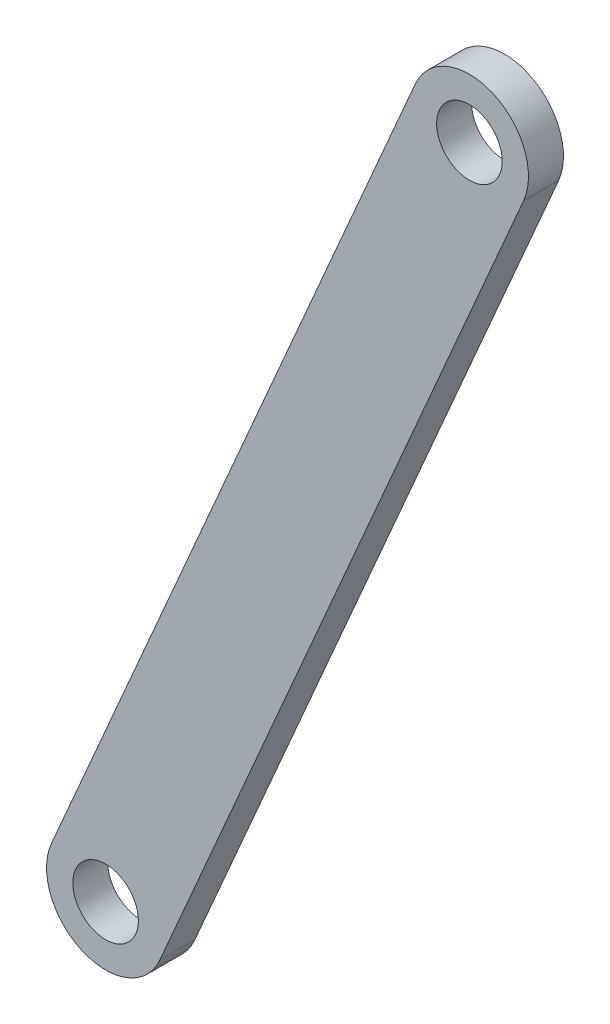
ISO-10303-21;
HEADER;
FILE_DESCRIPTION(('STEP AP214'),'2;1');
FILE_NAME('part.step','',(''),(''),'','','');
FILE_SCHEMA(('AUTOMOTIVE_DESIGN { 1 0 10303 214 1 1 1 1 }'));
ENDSEC;
DATA;
#1=APPLICATION_CONTEXT('core data for automotive mechanical design processes');
#2=APPLICATION_PROTOCOL_DEFINITION('international standard','automotive_design',2000,#1);
#3=PRODUCT_CONTEXT('',#1,'mechanical');
#4=PRODUCT('Part','Part','',(#3));
#5=PRODUCT_RELATED_PRODUCT_CATEGORY('part','',(#4));
#6=PRODUCT_DEFINITION_FORMATION('','',#4);
#7=PRODUCT_DEFINITION_CONTEXT('part definition',#1,'design');
#8=PRODUCT_DEFINITION('design','',#6,#7);
#9=PRODUCT_DEFINITION_SHAPE('','',#8);
#10=(LENGTH_UNIT() NAMED_UNIT(*) SI_UNIT(.MILLI.,.METRE.));
#11=(NAMED_UNIT(*) PLANE_ANGLE_UNIT() SI_UNIT($,.RADIAN.));
#12=(NAMED_UNIT(*) SI_UNIT($,.STERADIAN.) SOLID_ANGLE_UNIT());
#13=UNCERTAINTY_MEASURE_WITH_UNIT(LENGTH_MEASURE(1.E-05),#10,'distance_accuracy_value','');
#14=(GEOMETRIC_REPRESENTATION_CONTEXT(3) GLOBAL_UNCERTAINTY_ASSIGNED_CONTEXT((#13)) GLOBAL_UNIT_ASSIGNED_CONTEXT((#10,
#11,#12)) REPRESENTATION_CONTEXT('',''));
#15=CARTESIAN_POINT('',(0.,0.,0.));
#16=DIRECTION('',(0.,0.,1.));
#17=DIRECTION('',(1.,0.,0.));
#18=AXIS2_PLACEMENT_3D('',#15,#16,#17);
#19=CARTESIAN_POINT('',(0.,0.,50.));
#20=DIRECTION('',(0.,0.,1.));
#21=DIRECTION('',(1.,0.,0.));
#22=AXIS2_PLACEMENT_3D('',#19,#20,#21);
#23=PLANE('',#22);
#24=CARTESIAN_POINT('',(520.,1200.,50.));
#25=DIRECTION('',(0.,0.,1.));
#26=DIRECTION('',(1.,0.,0.));
#27=AXIS2_PLACEMENT_3D('',#24,#25,#26);
#28=CIRCLE('',#27,46.8749999999998);
#29=CARTESIAN_POINT('',(566.875,1200.,50.));
#30=VERTEX_POINT('',#29);
#31=EDGE_CURVE('E102',#30,#30,#28,.T.);
#32=ORIENTED_EDGE('',*,*,#31,.F.);
#33=EDGE_LOOP('',(#32));
#34=FACE_BOUND('',#33,.T.);
#35=CARTESIAN_POINT('',(0.,0.,50.));
#36=DIRECTION('',(0.,0.,1.));
#37=DIRECTION('',(1.,0.,0.));
#38=AXIS2_PLACEMENT_3D('',#35,#36,#37);
#39=CIRCLE('',#38,84.3750000000001);
#40=CARTESIAN_POINT('',(-77.4187558855249,33.5481275503941,50.));
#41=VERTEX_POINT('',#40);
#42=CARTESIAN_POINT('',(77.4187558855249,-33.5481275503941,50.));
#43=VERTEX_POINT('',#42);
#44=EDGE_CURVE('E87',#41,#43,#39,.T.);
#45=ORIENTED_EDGE('',*,*,#44,.T.);
#46=DIRECTION('',(0.3976074376343,0.917555625309924,0.));
#47=VECTOR('',#46,1.);
#48=CARTESIAN_POINT('',(77.4187558855249,-33.5481275503941,50.));
#49=LINE('',#48,#47);
#50=CARTESIAN_POINT('',(597.418755885525,1166.45187244961,50.));
#51=VERTEX_POINT('',#50);
#52=EDGE_CURVE('E82',#43,#51,#49,.T.);
#53=ORIENTED_EDGE('',*,*,#52,.T.);
#54=CARTESIAN_POINT('',(520.,1200.,50.));
#55=DIRECTION('',(0.,0.,1.));
#56=DIRECTION('',(1.,0.,0.));
#57=AXIS2_PLACEMENT_3D('',#54,#55,#56);
#58=CIRCLE('',#57,84.3749999999999);
#59=CARTESIAN_POINT('',(442.581244114475,1233.54812755039,50.));
#60=VERTEX_POINT('',#59);
#61=EDGE_CURVE('E85',#51,#60,#58,.T.);
#62=ORIENTED_EDGE('',*,*,#61,.T.);
#63=DIRECTION('',(-0.3976074376343,-0.917555625309924,0.));
#64=VECTOR('',#63,1.);
#65=CARTESIAN_POINT('',(-77.4187558855249,33.5481275503941,50.));
#66=LINE('',#65,#64);
#67=EDGE_CURVE('E52',#60,#41,#66,.T.);
#68=ORIENTED_EDGE('',*,*,#67,.T.);
#69=EDGE_LOOP('',(#45,#53,#62,#68));
#70=FACE_BOUND('',#69,.T.);
#71=CARTESIAN_POINT('',(0.,0.,50.));
#72=DIRECTION('',(0.,0.,1.));
#73=DIRECTION('',(1.,0.,0.));
#74=AXIS2_PLACEMENT_3D('',#71,#72,#73);
#75=CIRCLE('',#74,46.875);
#76=CARTESIAN_POINT('',(46.875,0.,50.));
#77=VERTEX_POINT('',#76);
#78=EDGE_CURVE('E117',#77,#77,#75,.T.);
#79=ORIENTED_EDGE('',*,*,#78,.F.);
#80=EDGE_LOOP('',(#79));
#81=FACE_BOUND('',#80,.T.);
#82=ADVANCED_FACE('F35',(#34,#70,#81),#23,.T.);
#83=CARTESIAN_POINT('',(0.,0.,0.));
#84=DIRECTION('',(0.,0.,1.));
#85=DIRECTION('',(1.,0.,0.));
#86=AXIS2_PLACEMENT_3D('',#83,#84,#85);
#87=PLANE('',#86);
#88=CARTESIAN_POINT('',(520.,1200.,0.));
#89=DIRECTION('',(0.,0.,1.));
#90=DIRECTION('',(1.,0.,0.));
#91=AXIS2_PLACEMENT_3D('',#88,#89,#90);
#92=CIRCLE('',#91,46.8749999999998);
#93=CARTESIAN_POINT('',(566.875,1200.,0.));
#94=VERTEX_POINT('',#93);
#95=EDGE_CURVE('E114',#94,#94,#92,.T.);
#96=ORIENTED_EDGE('',*,*,#95,.T.);
#97=EDGE_LOOP('',(#96));
#98=FACE_BOUND('',#97,.T.);
#99=CARTESIAN_POINT('',(0.,0.,0.));
#100=DIRECTION('',(0.,0.,1.));
#101=DIRECTION('',(1.,0.,0.));
#102=AXIS2_PLACEMENT_3D('',#99,#100,#101);
#103=CIRCLE('',#102,84.3750000000001);
#104=CARTESIAN_POINT('',(-77.4187558855249,33.5481275503941,0.));
#105=VERTEX_POINT('',#104);
#106=CARTESIAN_POINT('',(77.4187558855249,-33.5481275503941,0.));
#107=VERTEX_POINT('',#106);
#108=EDGE_CURVE('E99',#105,#107,#103,.T.);
#109=ORIENTED_EDGE('',*,*,#108,.F.);
#110=DIRECTION('',(-0.3976074376343,-0.917555625309924,0.));
#111=VECTOR('',#110,1.);
#112=CARTESIAN_POINT('',(-77.4187558855249,33.5481275503941,0.));
#113=LINE('',#112,#111);
#114=CARTESIAN_POINT('',(442.581244114475,1233.54812755039,0.));
#115=VERTEX_POINT('',#114);
#116=EDGE_CURVE('E75',#115,#105,#113,.T.);
#117=ORIENTED_EDGE('',*,*,#116,.F.);
#118=CARTESIAN_POINT('',(520.,1200.,0.));
#119=DIRECTION('',(0.,0.,1.));
#120=DIRECTION('',(1.,0.,0.));
#121=AXIS2_PLACEMENT_3D('',#118,#119,#120);
#122=CIRCLE('',#121,84.3749999999999);
#123=CARTESIAN_POINT('',(597.418755885525,1166.45187244961,0.));
#124=VERTEX_POINT('',#123);
#125=EDGE_CURVE('E69',#124,#115,#122,.T.);
#126=ORIENTED_EDGE('',*,*,#125,.F.);
#127=DIRECTION('',(0.3976074376343,0.917555625309924,0.));
#128=VECTOR('',#127,1.);
#129=CARTESIAN_POINT('',(77.4187558855249,-33.5481275503941,0.));
#130=LINE('',#129,#128);
#131=EDGE_CURVE('E91',#107,#124,#130,.T.);
#132=ORIENTED_EDGE('',*,*,#131,.F.);
#133=EDGE_LOOP('',(#109,#117,#126,#132));
#134=FACE_BOUND('',#133,.T.);
#135=CARTESIAN_POINT('',(0.,0.,0.));
#136=DIRECTION('',(0.,0.,1.));
#137=DIRECTION('',(1.,0.,0.));
#138=AXIS2_PLACEMENT_3D('',#135,#136,#137);
#139=CIRCLE('',#138,46.875);
#140=CARTESIAN_POINT('',(46.875,0.,0.));
#141=VERTEX_POINT('',#140);
#142=EDGE_CURVE('E120',#141,#141,#139,.T.);
#143=ORIENTED_EDGE('',*,*,#142,.T.);
#144=EDGE_LOOP('',(#143));
#145=FACE_BOUND('',#144,.T.);
#146=ADVANCED_FACE('F110',(#98,#134,#145),#87,.F.);
#147=CARTESIAN_POINT('',(0.,0.,50.));
#148=DIRECTION('',(0.,0.,-1.));
#149=DIRECTION('',(-1.,0.,0.));
#150=AXIS2_PLACEMENT_3D('',#147,#148,#149);
#151=CYLINDRICAL_SURFACE('',#150,84.3750000000001);
#152=ORIENTED_EDGE('',*,*,#108,.T.);
#153=DIRECTION('',(0.,0.,-1.));
#154=VECTOR('',#153,1.);
#155=CARTESIAN_POINT('',(77.4187558855249,-33.5481275503941,50.));
#156=LINE('',#155,#154);
#157=EDGE_CURVE('E11',#43,#107,#156,.T.);
#158=ORIENTED_EDGE('',*,*,#157,.F.);
#159=ORIENTED_EDGE('',*,*,#44,.F.);
#160=DIRECTION('',(0.,0.,-1.));
#161=VECTOR('',#160,1.);
#162=CARTESIAN_POINT('',(-77.4187558855249,33.5481275503941,50.));
#163=LINE('',#162,#161);
#164=EDGE_CURVE('E95',#41,#105,#163,.T.);
#165=ORIENTED_EDGE('',*,*,#164,.T.);
#166=EDGE_LOOP('',(#152,#158,#159,#165));
#167=FACE_BOUND('',#166,.T.);
#168=ADVANCED_FACE('F37',(#167),#151,.T.);
#169=CARTESIAN_POINT('',(77.4187558855249,-33.5481275503941,50.));
#170=DIRECTION('',(-0.917555625309924,0.3976074376343,0.));
#171=DIRECTION('',(-0.3976074376343,-0.917555625309924,0.));
#172=AXIS2_PLACEMENT_3D('',#169,#170,#171);
#173=PLANE('',#172);
#174=ORIENTED_EDGE('',*,*,#131,.T.);
#175=DIRECTION('',(0.,0.,-1.));
#176=VECTOR('',#175,1.);
#177=CARTESIAN_POINT('',(597.418755885525,1166.45187244961,50.));
#178=LINE('',#177,#176);
#179=EDGE_CURVE('E44',#51,#124,#178,.T.);
#180=ORIENTED_EDGE('',*,*,#179,.F.);
#181=ORIENTED_EDGE('',*,*,#52,.F.);
#182=ORIENTED_EDGE('',*,*,#157,.T.);
#183=EDGE_LOOP('',(#174,#180,#181,#182));
#184=FACE_BOUND('',#183,.T.);
#185=ADVANCED_FACE('F90',(#184),#173,.F.);
#186=CARTESIAN_POINT('',(520.,1200.,50.));
#187=DIRECTION('',(0.,0.,-1.));
#188=DIRECTION('',(-1.,0.,0.));
#189=AXIS2_PLACEMENT_3D('',#186,#187,#188);
#190=CYLINDRICAL_SURFACE('',#189,84.3749999999999);
#191=ORIENTED_EDGE('',*,*,#125,.T.);
#192=DIRECTION('',(0.,0.,-1.));
#193=VECTOR('',#192,1.);
#194=CARTESIAN_POINT('',(442.581244114475,1233.54812755039,50.));
#195=LINE('',#194,#193);
#196=EDGE_CURVE('E92',#60,#115,#195,.T.);
#197=ORIENTED_EDGE('',*,*,#196,.F.);
#198=ORIENTED_EDGE('',*,*,#61,.F.);
#199=ORIENTED_EDGE('',*,*,#179,.T.);
#200=EDGE_LOOP('',(#191,#197,#198,#199));
#201=FACE_BOUND('',#200,.T.);
#202=ADVANCED_FACE('F93',(#201),#190,.T.);
#203=CARTESIAN_POINT('',(-77.4187558855249,33.5481275503941,50.));
#204=DIRECTION('',(0.917555625309924,-0.3976074376343,0.));
#205=DIRECTION('',(0.3976074376343,0.917555625309924,0.));
#206=AXIS2_PLACEMENT_3D('',#203,#204,#205);
#207=PLANE('',#206);
#208=ORIENTED_EDGE('',*,*,#116,.T.);
#209=ORIENTED_EDGE('',*,*,#164,.F.);
#210=ORIENTED_EDGE('',*,*,#67,.F.);
#211=ORIENTED_EDGE('',*,*,#196,.T.);
#212=EDGE_LOOP('',(#208,#209,#210,#211));
#213=FACE_BOUND('',#212,.T.);
#214=ADVANCED_FACE('F107',(#213),#207,.F.);
#215=CARTESIAN_POINT('',(520.,1200.,50.));
#216=DIRECTION('',(0.,0.,-1.));
#217=DIRECTION('',(-1.,0.,0.));
#218=AXIS2_PLACEMENT_3D('',#215,#216,#217);
#219=CYLINDRICAL_SURFACE('',#218,46.8749999999998);
#220=ORIENTED_EDGE('',*,*,#31,.T.);
#221=EDGE_LOOP('',(#220));
#222=FACE_BOUND('',#221,.T.);
#223=ORIENTED_EDGE('',*,*,#95,.F.);
#224=EDGE_LOOP('',(#223));
#225=FACE_BOUND('',#224,.T.);
#226=ADVANCED_FACE('F138',(#222,#225),#219,.F.);
#227=CARTESIAN_POINT('',(0.,0.,50.));
#228=DIRECTION('',(0.,0.,-1.));
#229=DIRECTION('',(-1.,0.,0.));
#230=AXIS2_PLACEMENT_3D('',#227,#228,#229);
#231=CYLINDRICAL_SURFACE('',#230,46.875);
#232=ORIENTED_EDGE('',*,*,#78,.T.);
#233=EDGE_LOOP('',(#232));
#234=FACE_BOUND('',#233,.T.);
#235=ORIENTED_EDGE('',*,*,#142,.F.);
#236=EDGE_LOOP('',(#235));
#237=FACE_BOUND('',#236,.T.);
#238=ADVANCED_FACE('F126',(#234,#237),#231,.F.);
#239=CLOSED_SHELL('',(#82,#146,#168,#185,#202,#214,#226,#238));
#240=MANIFOLD_SOLID_BREP('B2',#239);
#241=ADVANCED_BREP_SHAPE_REPRESENTATION('',(#18,#240),#14);
#242=SHAPE_DEFINITION_REPRESENTATION(#9,#241);
ENDSEC;
END-ISO-10303-21;
